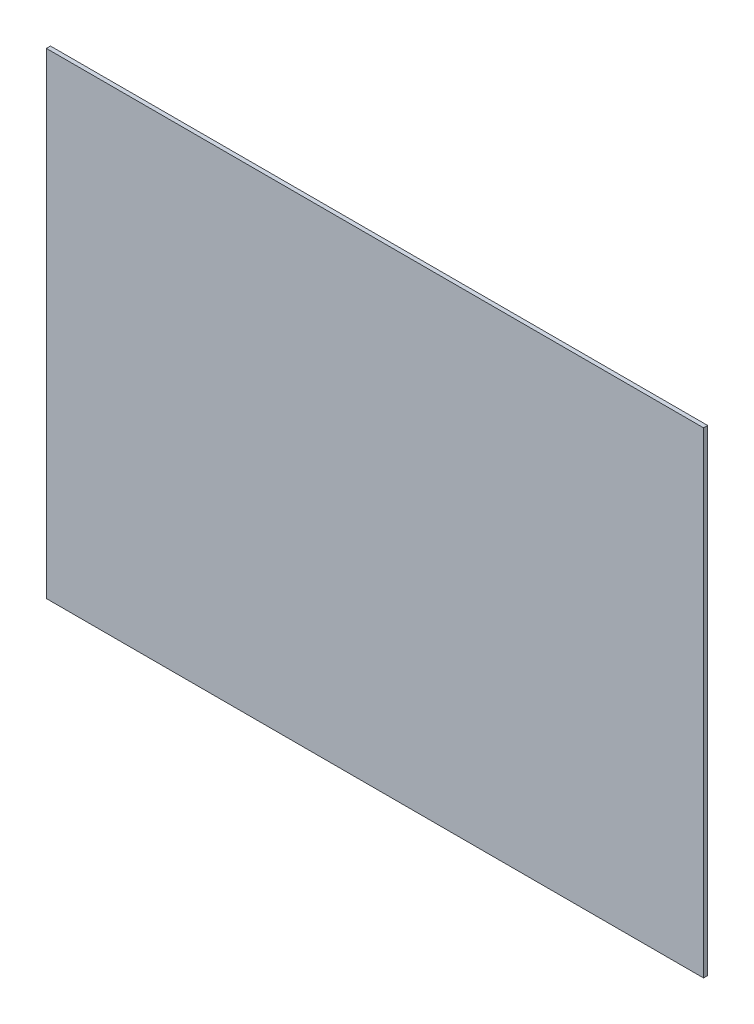
ISO-10303-21;
HEADER;
FILE_DESCRIPTION(('STEP AP214'),'2;1');
FILE_NAME('part.step','',(''),(''),'','','');
FILE_SCHEMA(('AUTOMOTIVE_DESIGN { 1 0 10303 214 1 1 1 1 }'));
ENDSEC;
DATA;
#1=APPLICATION_CONTEXT('core data for automotive mechanical design processes');
#2=APPLICATION_PROTOCOL_DEFINITION('international standard','automotive_design',2000,#1);
#3=PRODUCT_CONTEXT('',#1,'mechanical');
#4=PRODUCT('Part','Part','',(#3));
#5=PRODUCT_RELATED_PRODUCT_CATEGORY('part','',(#4));
#6=PRODUCT_DEFINITION_FORMATION('','',#4);
#7=PRODUCT_DEFINITION_CONTEXT('part definition',#1,'design');
#8=PRODUCT_DEFINITION('design','',#6,#7);
#9=PRODUCT_DEFINITION_SHAPE('','',#8);
#10=(LENGTH_UNIT() NAMED_UNIT(*) SI_UNIT(.MILLI.,.METRE.));
#11=(NAMED_UNIT(*) PLANE_ANGLE_UNIT() SI_UNIT($,.RADIAN.));
#12=(NAMED_UNIT(*) SI_UNIT($,.STERADIAN.) SOLID_ANGLE_UNIT());
#13=UNCERTAINTY_MEASURE_WITH_UNIT(LENGTH_MEASURE(1.E-05),#10,'distance_accuracy_value','');
#14=(GEOMETRIC_REPRESENTATION_CONTEXT(3) GLOBAL_UNCERTAINTY_ASSIGNED_CONTEXT((#13)) GLOBAL_UNIT_ASSIGNED_CONTEXT((#10,
#11,#12)) REPRESENTATION_CONTEXT('',''));
#15=CARTESIAN_POINT('',(0.,0.,0.));
#16=DIRECTION('',(0.,0.,1.));
#17=DIRECTION('',(1.,0.,0.));
#18=AXIS2_PLACEMENT_3D('',#15,#16,#17);
#19=CARTESIAN_POINT('',(400.,290.,5.));
#20=DIRECTION('',(-1.,0.,0.));
#21=DIRECTION('',(0.,-1.,0.));
#22=AXIS2_PLACEMENT_3D('',#19,#20,#21);
#23=PLANE('',#22);
#24=DIRECTION('',(0.,1.,0.));
#25=VECTOR('',#24,1.);
#26=CARTESIAN_POINT('',(400.,290.,0.));
#27=LINE('',#26,#25);
#28=CARTESIAN_POINT('',(400.,-290.,0.));
#29=VERTEX_POINT('',#28);
#30=CARTESIAN_POINT('',(400.,290.,0.));
#31=VERTEX_POINT('',#30);
#32=EDGE_CURVE('E99',#29,#31,#27,.T.);
#33=ORIENTED_EDGE('',*,*,#32,.T.);
#34=DIRECTION('',(0.,0.,-1.));
#35=VECTOR('',#34,1.);
#36=CARTESIAN_POINT('',(400.,290.,5.));
#37=LINE('',#36,#35);
#38=CARTESIAN_POINT('',(400.,290.,5.));
#39=VERTEX_POINT('',#38);
#40=EDGE_CURVE('E11',#39,#31,#37,.T.);
#41=ORIENTED_EDGE('',*,*,#40,.F.);
#42=DIRECTION('',(0.,1.,0.));
#43=VECTOR('',#42,1.);
#44=CARTESIAN_POINT('',(400.,290.,5.));
#45=LINE('',#44,#43);
#46=CARTESIAN_POINT('',(400.,-290.,5.));
#47=VERTEX_POINT('',#46);
#48=EDGE_CURVE('E87',#47,#39,#45,.T.);
#49=ORIENTED_EDGE('',*,*,#48,.F.);
#50=DIRECTION('',(0.,0.,-1.));
#51=VECTOR('',#50,1.);
#52=CARTESIAN_POINT('',(400.,-290.,5.));
#53=LINE('',#52,#51);
#54=EDGE_CURVE('E95',#47,#29,#53,.T.);
#55=ORIENTED_EDGE('',*,*,#54,.T.);
#56=EDGE_LOOP('',(#33,#41,#49,#55));
#57=FACE_BOUND('',#56,.T.);
#58=ADVANCED_FACE('F36',(#57),#23,.F.);
#59=CARTESIAN_POINT('',(-400.,290.,5.));
#60=DIRECTION('',(0.,-1.,0.));
#61=DIRECTION('',(0.,0.,-1.));
#62=AXIS2_PLACEMENT_3D('',#59,#60,#61);
#63=PLANE('',#62);
#64=DIRECTION('',(-1.,0.,0.));
#65=VECTOR('',#64,1.);
#66=CARTESIAN_POINT('',(-400.,290.,0.));
#67=LINE('',#66,#65);
#68=CARTESIAN_POINT('',(-400.,290.,0.));
#69=VERTEX_POINT('',#68);
#70=EDGE_CURVE('E91',#31,#69,#67,.T.);
#71=ORIENTED_EDGE('',*,*,#70,.T.);
#72=DIRECTION('',(0.,0.,-1.));
#73=VECTOR('',#72,1.);
#74=CARTESIAN_POINT('',(-400.,290.,5.));
#75=LINE('',#74,#73);
#76=CARTESIAN_POINT('',(-400.,290.,5.));
#77=VERTEX_POINT('',#76);
#78=EDGE_CURVE('E44',#77,#69,#75,.T.);
#79=ORIENTED_EDGE('',*,*,#78,.F.);
#80=DIRECTION('',(-1.,0.,0.));
#81=VECTOR('',#80,1.);
#82=CARTESIAN_POINT('',(-400.,290.,5.));
#83=LINE('',#82,#81);
#84=EDGE_CURVE('E82',#39,#77,#83,.T.);
#85=ORIENTED_EDGE('',*,*,#84,.F.);
#86=ORIENTED_EDGE('',*,*,#40,.T.);
#87=EDGE_LOOP('',(#71,#79,#85,#86));
#88=FACE_BOUND('',#87,.T.);
#89=ADVANCED_FACE('F90',(#88),#63,.F.);
#90=CARTESIAN_POINT('',(-400.,290.,5.));
#91=DIRECTION('',(1.,0.,0.));
#92=DIRECTION('',(0.,1.,0.));
#93=AXIS2_PLACEMENT_3D('',#90,#91,#92);
#94=PLANE('',#93);
#95=DIRECTION('',(0.,-1.,0.));
#96=VECTOR('',#95,1.);
#97=CARTESIAN_POINT('',(-400.,290.,0.));
#98=LINE('',#97,#96);
#99=CARTESIAN_POINT('',(-400.,-290.,0.));
#100=VERTEX_POINT('',#99);
#101=EDGE_CURVE('E69',#69,#100,#98,.T.);
#102=ORIENTED_EDGE('',*,*,#101,.T.);
#103=DIRECTION('',(0.,0.,-1.));
#104=VECTOR('',#103,1.);
#105=CARTESIAN_POINT('',(-400.,-290.,5.));
#106=LINE('',#105,#104);
#107=CARTESIAN_POINT('',(-400.,-290.,5.));
#108=VERTEX_POINT('',#107);
#109=EDGE_CURVE('E92',#108,#100,#106,.T.);
#110=ORIENTED_EDGE('',*,*,#109,.F.);
#111=DIRECTION('',(0.,-1.,0.));
#112=VECTOR('',#111,1.);
#113=CARTESIAN_POINT('',(-400.,290.,5.));
#114=LINE('',#113,#112);
#115=EDGE_CURVE('E85',#77,#108,#114,.T.);
#116=ORIENTED_EDGE('',*,*,#115,.F.);
#117=ORIENTED_EDGE('',*,*,#78,.T.);
#118=EDGE_LOOP('',(#102,#110,#116,#117));
#119=FACE_BOUND('',#118,.T.);
#120=ADVANCED_FACE('F93',(#119),#94,.F.);
#121=CARTESIAN_POINT('',(-400.,-290.,5.));
#122=DIRECTION('',(0.,1.,0.));
#123=DIRECTION('',(0.,0.,1.));
#124=AXIS2_PLACEMENT_3D('',#121,#122,#123);
#125=PLANE('',#124);
#126=DIRECTION('',(1.,0.,0.));
#127=VECTOR('',#126,1.);
#128=CARTESIAN_POINT('',(-400.,-290.,0.));
#129=LINE('',#128,#127);
#130=EDGE_CURVE('E75',#100,#29,#129,.T.);
#131=ORIENTED_EDGE('',*,*,#130,.T.);
#132=ORIENTED_EDGE('',*,*,#54,.F.);
#133=DIRECTION('',(1.,0.,0.));
#134=VECTOR('',#133,1.);
#135=CARTESIAN_POINT('',(-400.,-290.,5.));
#136=LINE('',#135,#134);
#137=EDGE_CURVE('E52',#108,#47,#136,.T.);
#138=ORIENTED_EDGE('',*,*,#137,.F.);
#139=ORIENTED_EDGE('',*,*,#109,.T.);
#140=EDGE_LOOP('',(#131,#132,#138,#139));
#141=FACE_BOUND('',#140,.T.);
#142=ADVANCED_FACE('F106',(#141),#125,.F.);
#143=CARTESIAN_POINT('',(0.,0.,5.));
#144=DIRECTION('',(0.,0.,1.));
#145=DIRECTION('',(1.,0.,0.));
#146=AXIS2_PLACEMENT_3D('',#143,#144,#145);
#147=PLANE('',#146);
#148=ORIENTED_EDGE('',*,*,#48,.T.);
#149=ORIENTED_EDGE('',*,*,#84,.T.);
#150=ORIENTED_EDGE('',*,*,#115,.T.);
#151=ORIENTED_EDGE('',*,*,#137,.T.);
#152=EDGE_LOOP('',(#148,#149,#150,#151));
#153=FACE_BOUND('',#152,.T.);
#154=ADVANCED_FACE('F83',(#153),#147,.T.);
#155=CARTESIAN_POINT('',(0.,0.,0.));
#156=DIRECTION('',(0.,0.,1.));
#157=DIRECTION('',(1.,0.,0.));
#158=AXIS2_PLACEMENT_3D('',#155,#156,#157);
#159=PLANE('',#158);
#160=ORIENTED_EDGE('',*,*,#32,.F.);
#161=ORIENTED_EDGE('',*,*,#130,.F.);
#162=ORIENTED_EDGE('',*,*,#101,.F.);
#163=ORIENTED_EDGE('',*,*,#70,.F.);
#164=EDGE_LOOP('',(#160,#161,#162,#163));
#165=FACE_BOUND('',#164,.T.);
#166=ADVANCED_FACE('F109',(#165),#159,.F.);
#167=CLOSED_SHELL('',(#58,#89,#120,#142,#154,#166));
#168=MANIFOLD_SOLID_BREP('B2',#167);
#169=ADVANCED_BREP_SHAPE_REPRESENTATION('',(#18,#168),#14);
#170=SHAPE_DEFINITION_REPRESENTATION(#9,#169);
ENDSEC;
END-ISO-10303-21;
